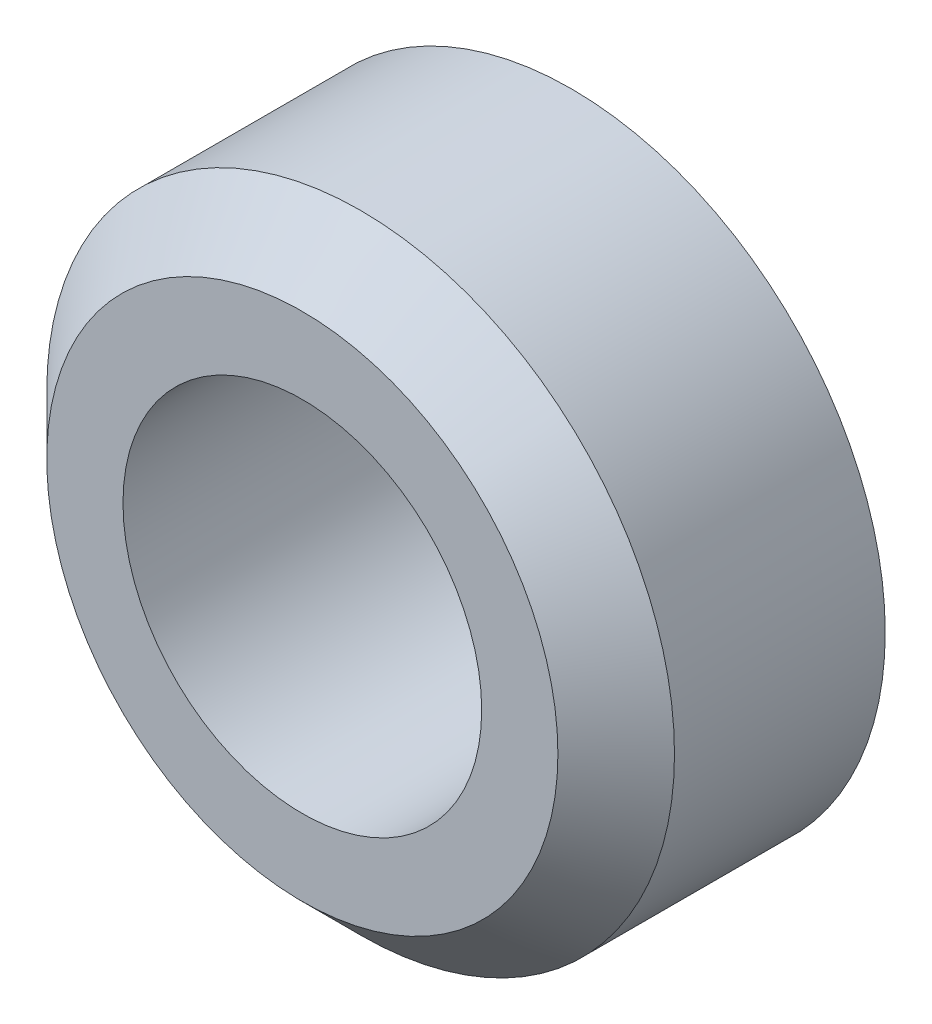
ISO-10303-21;
HEADER;
FILE_DESCRIPTION(('STEP AP214'),'2;1');
FILE_NAME('part.step','',(''),(''),'','','');
FILE_SCHEMA(('AUTOMOTIVE_DESIGN { 1 0 10303 214 1 1 1 1 }'));
ENDSEC;
DATA;
#1=APPLICATION_CONTEXT('core data for automotive mechanical design processes');
#2=APPLICATION_PROTOCOL_DEFINITION('international standard','automotive_design',2000,#1);
#3=PRODUCT_CONTEXT('',#1,'mechanical');
#4=PRODUCT('Part','Part','',(#3));
#5=PRODUCT_RELATED_PRODUCT_CATEGORY('part','',(#4));
#6=PRODUCT_DEFINITION_FORMATION('','',#4);
#7=PRODUCT_DEFINITION_CONTEXT('part definition',#1,'design');
#8=PRODUCT_DEFINITION('design','',#6,#7);
#9=PRODUCT_DEFINITION_SHAPE('','',#8);
#10=(LENGTH_UNIT() NAMED_UNIT(*) SI_UNIT(.MILLI.,.METRE.));
#11=(NAMED_UNIT(*) PLANE_ANGLE_UNIT() SI_UNIT($,.RADIAN.));
#12=(NAMED_UNIT(*) SI_UNIT($,.STERADIAN.) SOLID_ANGLE_UNIT());
#13=UNCERTAINTY_MEASURE_WITH_UNIT(LENGTH_MEASURE(1.E-05),#10,'distance_accuracy_value','');
#14=(GEOMETRIC_REPRESENTATION_CONTEXT(3) GLOBAL_UNCERTAINTY_ASSIGNED_CONTEXT((#13)) GLOBAL_UNIT_ASSIGNED_CONTEXT((#10,
#11,#12)) REPRESENTATION_CONTEXT('',''));
#15=CARTESIAN_POINT('',(0.,0.,0.));
#16=DIRECTION('',(0.,0.,1.));
#17=DIRECTION('',(1.,0.,0.));
#18=AXIS2_PLACEMENT_3D('',#15,#16,#17);
#19=CARTESIAN_POINT('',(0.,0.,6.));
#20=DIRECTION('',(0.,0.,1.));
#21=DIRECTION('',(1.,0.,0.));
#22=AXIS2_PLACEMENT_3D('',#19,#20,#21);
#23=PLANE('',#22);
#24=CARTESIAN_POINT('',(0.,0.,6.));
#25=DIRECTION('',(0.,0.,1.));
#26=DIRECTION('',(1.,0.,0.));
#27=AXIS2_PLACEMENT_3D('',#24,#25,#26);
#28=CIRCLE('',#27,5.7);
#29=CARTESIAN_POINT('',(5.7,0.,6.));
#30=VERTEX_POINT('',#29);
#31=EDGE_CURVE('E50',#30,#30,#28,.T.);
#32=ORIENTED_EDGE('',*,*,#31,.T.);
#33=EDGE_LOOP('',(#32));
#34=FACE_BOUND('',#33,.T.);
#35=CARTESIAN_POINT('',(0.,0.,6.));
#36=DIRECTION('',(0.,0.,1.));
#37=DIRECTION('',(1.,0.,0.));
#38=AXIS2_PLACEMENT_3D('',#35,#36,#37);
#39=CIRCLE('',#38,4.);
#40=CARTESIAN_POINT('',(4.,0.,6.));
#41=VERTEX_POINT('',#40);
#42=EDGE_CURVE('E54',#41,#41,#39,.T.);
#43=ORIENTED_EDGE('',*,*,#42,.F.);
#44=EDGE_LOOP('',(#43));
#45=FACE_BOUND('',#44,.T.);
#46=ADVANCED_FACE('F39',(#34,#45),#23,.T.);
#47=CARTESIAN_POINT('',(0.,0.,0.));
#48=DIRECTION('',(0.,0.,1.));
#49=DIRECTION('',(1.,0.,0.));
#50=AXIS2_PLACEMENT_3D('',#47,#48,#49);
#51=PLANE('',#50);
#52=CARTESIAN_POINT('',(0.,0.,0.));
#53=DIRECTION('',(0.,0.,1.));
#54=DIRECTION('',(1.,0.,0.));
#55=AXIS2_PLACEMENT_3D('',#52,#53,#54);
#56=CIRCLE('',#55,7.);
#57=CARTESIAN_POINT('',(7.,0.,0.));
#58=VERTEX_POINT('',#57);
#59=EDGE_CURVE('E51',#58,#58,#56,.T.);
#60=ORIENTED_EDGE('',*,*,#59,.F.);
#61=EDGE_LOOP('',(#60));
#62=FACE_BOUND('',#61,.T.);
#63=CARTESIAN_POINT('',(0.,0.,0.));
#64=DIRECTION('',(0.,0.,1.));
#65=DIRECTION('',(1.,0.,0.));
#66=AXIS2_PLACEMENT_3D('',#63,#64,#65);
#67=CIRCLE('',#66,4.);
#68=CARTESIAN_POINT('',(4.,0.,0.));
#69=VERTEX_POINT('',#68);
#70=EDGE_CURVE('E59',#69,#69,#67,.T.);
#71=ORIENTED_EDGE('',*,*,#70,.T.);
#72=EDGE_LOOP('',(#71));
#73=FACE_BOUND('',#72,.T.);
#74=ADVANCED_FACE('F67',(#62,#73),#51,.F.);
#75=CARTESIAN_POINT('',(0.,0.,6.));
#76=DIRECTION('',(0.,0.,-1.));
#77=DIRECTION('',(-1.,0.,0.));
#78=AXIS2_PLACEMENT_3D('',#75,#76,#77);
#79=CYLINDRICAL_SURFACE('',#78,7.);
#80=CARTESIAN_POINT('',(0.,0.,4.7));
#81=DIRECTION('',(0.,0.,1.));
#82=DIRECTION('',(1.,0.,0.));
#83=AXIS2_PLACEMENT_3D('',#80,#81,#82);
#84=CIRCLE('',#83,7.);
#85=CARTESIAN_POINT('',(7.,0.,4.7));
#86=VERTEX_POINT('',#85);
#87=EDGE_CURVE('E10',#86,#86,#84,.F.);
#88=ORIENTED_EDGE('',*,*,#87,.T.);
#89=EDGE_LOOP('',(#88));
#90=FACE_BOUND('',#89,.T.);
#91=ORIENTED_EDGE('',*,*,#59,.T.);
#92=EDGE_LOOP('',(#91));
#93=FACE_BOUND('',#92,.T.);
#94=ADVANCED_FACE('F73',(#90,#93),#79,.T.);
#95=CARTESIAN_POINT('',(0.,0.,6.));
#96=DIRECTION('',(0.,0.,-1.));
#97=DIRECTION('',(-1.,0.,0.));
#98=AXIS2_PLACEMENT_3D('',#95,#96,#97);
#99=CYLINDRICAL_SURFACE('',#98,4.);
#100=ORIENTED_EDGE('',*,*,#42,.T.);
#101=EDGE_LOOP('',(#100));
#102=FACE_BOUND('',#101,.T.);
#103=ORIENTED_EDGE('',*,*,#70,.F.);
#104=EDGE_LOOP('',(#103));
#105=FACE_BOUND('',#104,.T.);
#106=ADVANCED_FACE('F61',(#102,#105),#99,.F.);
#107=CARTESIAN_POINT('',(0.,0.,6.));
#108=DIRECTION('',(0.,0.,-1.));
#109=DIRECTION('',(-1.,0.,0.));
#110=AXIS2_PLACEMENT_3D('',#107,#108,#109);
#111=CONICAL_SURFACE('',#110,5.7,0.785398163397445);
#112=ORIENTED_EDGE('',*,*,#87,.F.);
#113=EDGE_LOOP('',(#112));
#114=FACE_BOUND('',#113,.T.);
#115=ORIENTED_EDGE('',*,*,#31,.F.);
#116=EDGE_LOOP('',(#115));
#117=FACE_BOUND('',#116,.T.);
#118=ADVANCED_FACE('F45',(#114,#117),#111,.T.);
#119=CLOSED_SHELL('',(#46,#74,#94,#106,#118));
#120=MANIFOLD_SOLID_BREP('B2',#119);
#121=ADVANCED_BREP_SHAPE_REPRESENTATION('',(#18,#120),#14);
#122=SHAPE_DEFINITION_REPRESENTATION(#9,#121);
ENDSEC;
END-ISO-10303-21;
